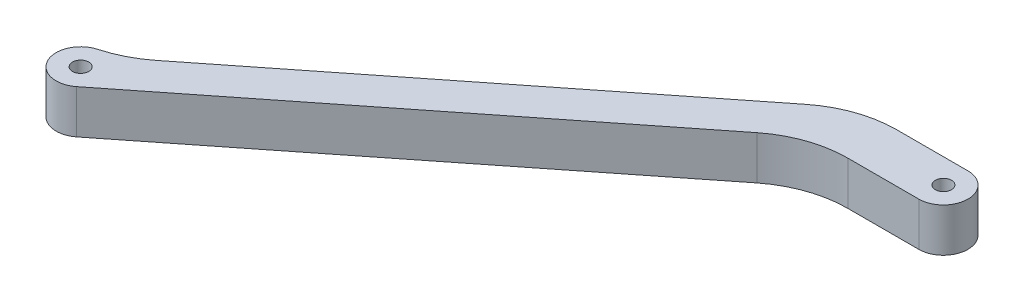
ISO-10303-21;
HEADER;
FILE_DESCRIPTION(('STEP AP214'),'2;1');
FILE_NAME('part.step','',(''),(''),'','','');
FILE_SCHEMA(('AUTOMOTIVE_DESIGN { 1 0 10303 214 1 1 1 1 }'));
ENDSEC;
DATA;
#1=APPLICATION_CONTEXT('core data for automotive mechanical design processes');
#2=APPLICATION_PROTOCOL_DEFINITION('international standard','automotive_design',2000,#1);
#3=PRODUCT_CONTEXT('',#1,'mechanical');
#4=PRODUCT('Part','Part','',(#3));
#5=PRODUCT_RELATED_PRODUCT_CATEGORY('part','',(#4));
#6=PRODUCT_DEFINITION_FORMATION('','',#4);
#7=PRODUCT_DEFINITION_CONTEXT('part definition',#1,'design');
#8=PRODUCT_DEFINITION('design','',#6,#7);
#9=PRODUCT_DEFINITION_SHAPE('','',#8);
#10=(LENGTH_UNIT() NAMED_UNIT(*) SI_UNIT(.MILLI.,.METRE.));
#11=(NAMED_UNIT(*) PLANE_ANGLE_UNIT() SI_UNIT($,.RADIAN.));
#12=(NAMED_UNIT(*) SI_UNIT($,.STERADIAN.) SOLID_ANGLE_UNIT());
#13=UNCERTAINTY_MEASURE_WITH_UNIT(LENGTH_MEASURE(1.E-05),#10,'distance_accuracy_value','');
#14=(GEOMETRIC_REPRESENTATION_CONTEXT(3) GLOBAL_UNCERTAINTY_ASSIGNED_CONTEXT((#13)) GLOBAL_UNIT_ASSIGNED_CONTEXT((#10,
#11,#12)) REPRESENTATION_CONTEXT('',''));
#15=CARTESIAN_POINT('',(0.,0.,0.));
#16=DIRECTION('',(0.,0.,1.));
#17=DIRECTION('',(1.,0.,0.));
#18=AXIS2_PLACEMENT_3D('',#15,#16,#17);
#19=CARTESIAN_POINT('',(49.,-4.,-30.1999999999999));
#20=DIRECTION('',(0.,1.,0.));
#21=DIRECTION('',(0.,0.,1.));
#22=AXIS2_PLACEMENT_3D('',#19,#20,#21);
#23=CYLINDRICAL_SURFACE('',#22,2.25);
#24=CARTESIAN_POINT('',(49.,0.,-30.1999999999999));
#25=DIRECTION('',(0.,1.,0.));
#26=DIRECTION('',(0.,0.,1.));
#27=AXIS2_PLACEMENT_3D('',#24,#25,#26);
#28=CIRCLE('',#27,2.25);
#29=CARTESIAN_POINT('',(49.,0.,-27.9499999999999));
#30=VERTEX_POINT('',#29);
#31=CARTESIAN_POINT('',(49.,0.,-32.4499999999999));
#32=VERTEX_POINT('',#31);
#33=EDGE_CURVE('E157',#30,#32,#28,.T.);
#34=ORIENTED_EDGE('',*,*,#33,.F.);
#35=DIRECTION('',(0.,1.,0.));
#36=VECTOR('',#35,1.);
#37=CARTESIAN_POINT('',(49.,-4.,-27.9499999999999));
#38=LINE('',#37,#36);
#39=CARTESIAN_POINT('',(49.,-4.,-27.9499999999999));
#40=VERTEX_POINT('',#39);
#41=EDGE_CURVE('E138',#40,#30,#38,.T.);
#42=ORIENTED_EDGE('',*,*,#41,.F.);
#43=CARTESIAN_POINT('',(49.,-4.,-30.1999999999999));
#44=DIRECTION('',(0.,1.,0.));
#45=DIRECTION('',(0.,0.,1.));
#46=AXIS2_PLACEMENT_3D('',#43,#44,#45);
#47=CIRCLE('',#46,2.25);
#48=CARTESIAN_POINT('',(49.,-4.,-32.4499999999999));
#49=VERTEX_POINT('',#48);
#50=EDGE_CURVE('E117',#40,#49,#47,.T.);
#51=ORIENTED_EDGE('',*,*,#50,.T.);
#52=DIRECTION('',(0.,1.,0.));
#53=VECTOR('',#52,1.);
#54=CARTESIAN_POINT('',(49.,-4.,-32.4499999999999));
#55=LINE('',#54,#53);
#56=EDGE_CURVE('E126',#49,#32,#55,.T.);
#57=ORIENTED_EDGE('',*,*,#56,.T.);
#58=EDGE_LOOP('',(#34,#42,#51,#57));
#59=FACE_BOUND('',#58,.T.);
#60=ADVANCED_FACE('F40',(#59),#23,.T.);
#61=CARTESIAN_POINT('',(0.,-4.,-27.9499999999999));
#62=DIRECTION('',(0.,0.,1.));
#63=DIRECTION('',(1.,0.,0.));
#64=AXIS2_PLACEMENT_3D('',#61,#62,#63);
#65=PLANE('',#64);
#66=DIRECTION('',(1.,0.,0.));
#67=VECTOR('',#66,1.);
#68=CARTESIAN_POINT('',(0.,0.,-27.9499999999999));
#69=LINE('',#68,#67);
#70=CARTESIAN_POINT('',(42.474119998746,0.,-27.9499999999999));
#71=VERTEX_POINT('',#70);
#72=EDGE_CURVE('E168',#71,#30,#69,.T.);
#73=ORIENTED_EDGE('',*,*,#72,.F.);
#74=DIRECTION('',(0.,1.,0.));
#75=VECTOR('',#74,1.);
#76=CARTESIAN_POINT('',(42.474119998746,-4.,-27.9499999999999));
#77=LINE('',#76,#75);
#78=CARTESIAN_POINT('',(42.474119998746,-4.,-27.9499999999999));
#79=VERTEX_POINT('',#78);
#80=EDGE_CURVE('E189',#71,#79,#77,.F.);
#81=ORIENTED_EDGE('',*,*,#80,.T.);
#82=DIRECTION('',(1.,0.,0.));
#83=VECTOR('',#82,1.);
#84=CARTESIAN_POINT('',(0.,-4.,-27.9499999999999));
#85=LINE('',#84,#83);
#86=EDGE_CURVE('E150',#79,#40,#85,.T.);
#87=ORIENTED_EDGE('',*,*,#86,.T.);
#88=ORIENTED_EDGE('',*,*,#41,.T.);
#89=EDGE_LOOP('',(#73,#81,#87,#88));
#90=FACE_BOUND('',#89,.T.);
#91=ADVANCED_FACE('F203',(#90),#65,.T.);
#92=CARTESIAN_POINT('',(1.39498602492714,-4.,1.76536511528295));
#93=DIRECTION('',(-0.619993788856505,0.,-0.784606717903533));
#94=DIRECTION('',(-0.784606717903533,0.,0.619993788856505));
#95=AXIS2_PLACEMENT_3D('',#92,#93,#94);
#96=PLANE('',#95);
#97=DIRECTION('',(-0.784606717903534,0.,0.619993788856506));
#98=VECTOR('',#97,1.);
#99=CARTESIAN_POINT('',(1.39498602492714,-4.,1.76536511528295));
#100=LINE('',#99,#98);
#101=CARTESIAN_POINT('',(36.2741821101809,-4.,-25.7960671790353));
#102=VERTEX_POINT('',#101);
#103=CARTESIAN_POINT('',(1.39498602492714,-4.,1.76536511528295));
#104=VERTEX_POINT('',#103);
#105=EDGE_CURVE('E148',#102,#104,#100,.T.);
#106=ORIENTED_EDGE('',*,*,#105,.F.);
#107=DIRECTION('',(0.,1.,0.));
#108=VECTOR('',#107,1.);
#109=CARTESIAN_POINT('',(36.2741821101809,-4.,-25.7960671790353));
#110=LINE('',#109,#108);
#111=CARTESIAN_POINT('',(36.2741821101809,0.,-25.7960671790353));
#112=VERTEX_POINT('',#111);
#113=EDGE_CURVE('E186',#102,#112,#110,.T.);
#114=ORIENTED_EDGE('',*,*,#113,.T.);
#115=DIRECTION('',(-0.784606717903534,0.,0.619993788856506));
#116=VECTOR('',#115,1.);
#117=CARTESIAN_POINT('',(1.39498602492714,0.,1.76536511528295));
#118=LINE('',#117,#116);
#119=CARTESIAN_POINT('',(1.39498602492714,0.,1.76536511528295));
#120=VERTEX_POINT('',#119);
#121=EDGE_CURVE('E166',#112,#120,#118,.T.);
#122=ORIENTED_EDGE('',*,*,#121,.T.);
#123=DIRECTION('',(0.,1.,0.));
#124=VECTOR('',#123,1.);
#125=CARTESIAN_POINT('',(1.39498602492714,-4.,1.76536511528295));
#126=LINE('',#125,#124);
#127=EDGE_CURVE('E133',#104,#120,#126,.T.);
#128=ORIENTED_EDGE('',*,*,#127,.F.);
#129=EDGE_LOOP('',(#106,#114,#122,#128));
#130=FACE_BOUND('',#129,.T.);
#131=ADVANCED_FACE('F205',(#130),#96,.F.);
#132=CARTESIAN_POINT('',(0.,-4.,0.));
#133=DIRECTION('',(0.,1.,0.));
#134=DIRECTION('',(0.,0.,1.));
#135=AXIS2_PLACEMENT_3D('',#132,#133,#134);
#136=CYLINDRICAL_SURFACE('',#135,2.25);
#137=CARTESIAN_POINT('',(0.,0.,0.));
#138=DIRECTION('',(0.,1.,0.));
#139=DIRECTION('',(0.,0.,1.));
#140=AXIS2_PLACEMENT_3D('',#137,#138,#139);
#141=CIRCLE('',#140,2.25);
#142=CARTESIAN_POINT('',(-0.596371316371873,0.,-2.16952558247394));
#143=VERTEX_POINT('',#142);
#144=EDGE_CURVE('E163',#143,#120,#141,.T.);
#145=ORIENTED_EDGE('',*,*,#144,.F.);
#146=DIRECTION('',(0.,1.,0.));
#147=VECTOR('',#146,1.);
#148=CARTESIAN_POINT('',(-0.596371316371873,-4.,-2.16952558247394));
#149=LINE('',#148,#147);
#150=CARTESIAN_POINT('',(-0.596371316371873,-4.,-2.16952558247394));
#151=VERTEX_POINT('',#150);
#152=EDGE_CURVE('E55',#143,#151,#149,.F.);
#153=ORIENTED_EDGE('',*,*,#152,.T.);
#154=CARTESIAN_POINT('',(0.,-4.,0.));
#155=DIRECTION('',(0.,1.,0.));
#156=DIRECTION('',(0.,0.,1.));
#157=AXIS2_PLACEMENT_3D('',#154,#155,#156);
#158=CIRCLE('',#157,2.25);
#159=EDGE_CURVE('E146',#151,#104,#158,.T.);
#160=ORIENTED_EDGE('',*,*,#159,.T.);
#161=ORIENTED_EDGE('',*,*,#127,.T.);
#162=EDGE_LOOP('',(#145,#153,#160,#161));
#163=FACE_BOUND('',#162,.T.);
#164=ADVANCED_FACE('F239',(#163),#136,.T.);
#165=CARTESIAN_POINT('',(-0.794044788151609,-4.,-1.00486954272413));
#166=DIRECTION('',(0.619993788856506,0.,0.784606717903533));
#167=DIRECTION('',(0.784606717903533,0.,-0.619993788856506));
#168=AXIS2_PLACEMENT_3D('',#165,#166,#167);
#169=PLANE('',#168);
#170=DIRECTION('',(0.784606717903533,0.,-0.619993788856506));
#171=VECTOR('',#170,1.);
#172=CARTESIAN_POINT('',(-0.794044788151609,0.,-1.00486954272413));
#173=LINE('',#172,#171);
#174=CARTESIAN_POINT('',(2.9530273883182,0.,-3.965794325545));
#175=VERTEX_POINT('',#174);
#176=CARTESIAN_POINT('',(36.2741821101809,0.,-30.2960671790353));
#177=VERTEX_POINT('',#176);
#178=EDGE_CURVE('E160',#175,#177,#173,.T.);
#179=ORIENTED_EDGE('',*,*,#178,.T.);
#180=DIRECTION('',(0.,1.,0.));
#181=VECTOR('',#180,1.);
#182=CARTESIAN_POINT('',(36.2741821101809,-4.,-30.2960671790353));
#183=LINE('',#182,#181);
#184=CARTESIAN_POINT('',(36.2741821101809,-4.,-30.2960671790353));
#185=VERTEX_POINT('',#184);
#186=EDGE_CURVE('E182',#177,#185,#183,.F.);
#187=ORIENTED_EDGE('',*,*,#186,.T.);
#188=DIRECTION('',(0.784606717903533,0.,-0.619993788856506));
#189=VECTOR('',#188,1.);
#190=CARTESIAN_POINT('',(-0.794044788151609,-4.,-1.00486954272413));
#191=LINE('',#190,#189);
#192=CARTESIAN_POINT('',(2.9530273883182,-4.,-3.965794325545));
#193=VERTEX_POINT('',#192);
#194=EDGE_CURVE('E123',#193,#185,#191,.T.);
#195=ORIENTED_EDGE('',*,*,#194,.F.);
#196=DIRECTION('',(0.,1.,0.));
#197=VECTOR('',#196,1.);
#198=CARTESIAN_POINT('',(2.9530273883182,-4.,-3.965794325545));
#199=LINE('',#198,#197);
#200=EDGE_CURVE('E179',#193,#175,#199,.T.);
#201=ORIENTED_EDGE('',*,*,#200,.T.);
#202=EDGE_LOOP('',(#179,#187,#195,#201));
#203=FACE_BOUND('',#202,.T.);
#204=ADVANCED_FACE('F214',(#203),#169,.F.);
#205=CARTESIAN_POINT('',(0.,-4.,0.));
#206=DIRECTION('',(0.,1.,0.));
#207=DIRECTION('',(0.,0.,1.));
#208=AXIS2_PLACEMENT_3D('',#205,#206,#207);
#209=CYLINDRICAL_SURFACE('',#208,0.750000000000001);
#210=CARTESIAN_POINT('',(0.,-4.,0.));
#211=DIRECTION('',(0.,1.,0.));
#212=DIRECTION('',(0.,0.,1.));
#213=AXIS2_PLACEMENT_3D('',#210,#211,#212);
#214=CIRCLE('',#213,0.750000000000001);
#215=CARTESIAN_POINT('',(0.,-4.,0.750000000000001));
#216=VERTEX_POINT('',#215);
#217=EDGE_CURVE('E152',#216,#216,#214,.T.);
#218=ORIENTED_EDGE('',*,*,#217,.F.);
#219=EDGE_LOOP('',(#218));
#220=FACE_BOUND('',#219,.T.);
#221=CARTESIAN_POINT('',(0.,0.,0.));
#222=DIRECTION('',(0.,1.,0.));
#223=DIRECTION('',(0.,0.,1.));
#224=AXIS2_PLACEMENT_3D('',#221,#222,#223);
#225=CIRCLE('',#224,0.750000000000001);
#226=CARTESIAN_POINT('',(0.,0.,0.750000000000001));
#227=VERTEX_POINT('',#226);
#228=EDGE_CURVE('E142',#227,#227,#225,.T.);
#229=ORIENTED_EDGE('',*,*,#228,.T.);
#230=EDGE_LOOP('',(#229));
#231=FACE_BOUND('',#230,.T.);
#232=ADVANCED_FACE('F236',(#220,#231),#209,.F.);
#233=CARTESIAN_POINT('',(0.,-4.,-32.4499999999999));
#234=DIRECTION('',(0.,0.,1.));
#235=DIRECTION('',(1.,0.,0.));
#236=AXIS2_PLACEMENT_3D('',#233,#234,#235);
#237=PLANE('',#236);
#238=DIRECTION('',(1.,0.,0.));
#239=VECTOR('',#238,1.);
#240=CARTESIAN_POINT('',(0.,-4.,-32.4499999999999));
#241=LINE('',#240,#239);
#242=CARTESIAN_POINT('',(42.4741199987459,-4.,-32.4499999999999));
#243=VERTEX_POINT('',#242);
#244=EDGE_CURVE('E111',#243,#49,#241,.T.);
#245=ORIENTED_EDGE('',*,*,#244,.F.);
#246=DIRECTION('',(0.,1.,0.));
#247=VECTOR('',#246,1.);
#248=CARTESIAN_POINT('',(42.4741199987459,-4.,-32.4499999999999));
#249=LINE('',#248,#247);
#250=CARTESIAN_POINT('',(42.4741199987459,0.,-32.4499999999999));
#251=VERTEX_POINT('',#250);
#252=EDGE_CURVE('E173',#243,#251,#249,.T.);
#253=ORIENTED_EDGE('',*,*,#252,.T.);
#254=DIRECTION('',(1.,0.,0.));
#255=VECTOR('',#254,1.);
#256=CARTESIAN_POINT('',(0.,0.,-32.4499999999999));
#257=LINE('',#256,#255);
#258=EDGE_CURVE('E129',#251,#32,#257,.T.);
#259=ORIENTED_EDGE('',*,*,#258,.T.);
#260=ORIENTED_EDGE('',*,*,#56,.F.);
#261=EDGE_LOOP('',(#245,#253,#259,#260));
#262=FACE_BOUND('',#261,.T.);
#263=ADVANCED_FACE('F127',(#262),#237,.F.);
#264=CARTESIAN_POINT('',(49.,-4.,-30.1999999999999));
#265=DIRECTION('',(0.,1.,0.));
#266=DIRECTION('',(0.,0.,1.));
#267=AXIS2_PLACEMENT_3D('',#264,#265,#266);
#268=CYLINDRICAL_SURFACE('',#267,0.749999999999999);
#269=CARTESIAN_POINT('',(49.,-4.,-30.1999999999999));
#270=DIRECTION('',(0.,1.,0.));
#271=DIRECTION('',(0.,0.,1.));
#272=AXIS2_PLACEMENT_3D('',#269,#270,#271);
#273=CIRCLE('',#272,0.749999999999999);
#274=CARTESIAN_POINT('',(49.,-4.,-29.4499999999999));
#275=VERTEX_POINT('',#274);
#276=EDGE_CURVE('E134',#275,#275,#273,.T.);
#277=ORIENTED_EDGE('',*,*,#276,.F.);
#278=EDGE_LOOP('',(#277));
#279=FACE_BOUND('',#278,.T.);
#280=CARTESIAN_POINT('',(49.,0.,-30.1999999999999));
#281=DIRECTION('',(0.,1.,0.));
#282=DIRECTION('',(0.,0.,1.));
#283=AXIS2_PLACEMENT_3D('',#280,#281,#282);
#284=CIRCLE('',#283,0.749999999999999);
#285=CARTESIAN_POINT('',(49.,0.,-29.4499999999999));
#286=VERTEX_POINT('',#285);
#287=EDGE_CURVE('E139',#286,#286,#284,.T.);
#288=ORIENTED_EDGE('',*,*,#287,.T.);
#289=EDGE_LOOP('',(#288));
#290=FACE_BOUND('',#289,.T.);
#291=ADVANCED_FACE('F235',(#279,#290),#268,.F.);
#292=CARTESIAN_POINT('',(0.,-4.,0.));
#293=DIRECTION('',(0.,1.,0.));
#294=DIRECTION('',(0.,0.,1.));
#295=AXIS2_PLACEMENT_3D('',#292,#293,#294);
#296=PLANE('',#295);
#297=ORIENTED_EDGE('',*,*,#194,.T.);
#298=CARTESIAN_POINT('',(42.4741199987459,-4.,-22.4499999999999));
#299=DIRECTION('',(0.,1.,0.));
#300=DIRECTION('',(0.,0.,1.));
#301=AXIS2_PLACEMENT_3D('',#298,#299,#300);
#302=CIRCLE('',#301,10.);
#303=EDGE_CURVE('E119',#185,#243,#302,.F.);
#304=ORIENTED_EDGE('',*,*,#303,.T.);
#305=ORIENTED_EDGE('',*,*,#244,.T.);
#306=ORIENTED_EDGE('',*,*,#50,.F.);
#307=ORIENTED_EDGE('',*,*,#86,.F.);
#308=CARTESIAN_POINT('',(42.474119998746,-4.,-17.9499999999999));
#309=DIRECTION('',(0.,1.,0.));
#310=DIRECTION('',(0.,0.,1.));
#311=AXIS2_PLACEMENT_3D('',#308,#309,#310);
#312=CIRCLE('',#311,10.);
#313=EDGE_CURVE('E11',#79,#102,#312,.T.);
#314=ORIENTED_EDGE('',*,*,#313,.T.);
#315=ORIENTED_EDGE('',*,*,#105,.T.);
#316=ORIENTED_EDGE('',*,*,#159,.F.);
#317=CARTESIAN_POINT('',(-3.24691050024686,-4.,-11.8118615045803));
#318=DIRECTION('',(0.,1.,0.));
#319=DIRECTION('',(0.,0.,1.));
#320=AXIS2_PLACEMENT_3D('',#317,#318,#319);
#321=CIRCLE('',#320,10.);
#322=EDGE_CURVE('E193',#151,#193,#321,.T.);
#323=ORIENTED_EDGE('',*,*,#322,.T.);
#324=EDGE_LOOP('',(#297,#304,#305,#306,#307,#314,#315,#316,#323));
#325=FACE_BOUND('',#324,.T.);
#326=ORIENTED_EDGE('',*,*,#217,.T.);
#327=EDGE_LOOP('',(#326));
#328=FACE_BOUND('',#327,.T.);
#329=ORIENTED_EDGE('',*,*,#276,.T.);
#330=EDGE_LOOP('',(#329));
#331=FACE_BOUND('',#330,.T.);
#332=ADVANCED_FACE('F114',(#325,#328,#331),#296,.F.);
#333=CARTESIAN_POINT('',(0.,0.,0.));
#334=DIRECTION('',(0.,1.,0.));
#335=DIRECTION('',(0.,0.,1.));
#336=AXIS2_PLACEMENT_3D('',#333,#334,#335);
#337=PLANE('',#336);
#338=ORIENTED_EDGE('',*,*,#258,.F.);
#339=CARTESIAN_POINT('',(42.4741199987459,0.,-22.4499999999999));
#340=DIRECTION('',(0.,1.,0.));
#341=DIRECTION('',(0.,0.,1.));
#342=AXIS2_PLACEMENT_3D('',#339,#340,#341);
#343=CIRCLE('',#342,10.);
#344=EDGE_CURVE('E177',#251,#177,#343,.T.);
#345=ORIENTED_EDGE('',*,*,#344,.T.);
#346=ORIENTED_EDGE('',*,*,#178,.F.);
#347=CARTESIAN_POINT('',(-3.24691050024686,0.,-11.8118615045803));
#348=DIRECTION('',(0.,1.,0.));
#349=DIRECTION('',(0.,0.,1.));
#350=AXIS2_PLACEMENT_3D('',#347,#348,#349);
#351=CIRCLE('',#350,10.);
#352=EDGE_CURVE('E191',#175,#143,#351,.F.);
#353=ORIENTED_EDGE('',*,*,#352,.T.);
#354=ORIENTED_EDGE('',*,*,#144,.T.);
#355=ORIENTED_EDGE('',*,*,#121,.F.);
#356=CARTESIAN_POINT('',(42.474119998746,0.,-17.9499999999999));
#357=DIRECTION('',(0.,1.,0.));
#358=DIRECTION('',(0.,0.,1.));
#359=AXIS2_PLACEMENT_3D('',#356,#357,#358);
#360=CIRCLE('',#359,10.);
#361=EDGE_CURVE('E48',#112,#71,#360,.F.);
#362=ORIENTED_EDGE('',*,*,#361,.T.);
#363=ORIENTED_EDGE('',*,*,#72,.T.);
#364=ORIENTED_EDGE('',*,*,#33,.T.);
#365=EDGE_LOOP('',(#338,#345,#346,#353,#354,#355,#362,#363,#364));
#366=FACE_BOUND('',#365,.T.);
#367=ORIENTED_EDGE('',*,*,#228,.F.);
#368=EDGE_LOOP('',(#367));
#369=FACE_BOUND('',#368,.T.);
#370=ORIENTED_EDGE('',*,*,#287,.F.);
#371=EDGE_LOOP('',(#370));
#372=FACE_BOUND('',#371,.T.);
#373=ADVANCED_FACE('F197',(#366,#369,#372),#337,.T.);
#374=CARTESIAN_POINT('',(42.4741199987459,-4.,-22.4499999999999));
#375=DIRECTION('',(0.,1.,0.));
#376=DIRECTION('',(0.,0.,1.));
#377=AXIS2_PLACEMENT_3D('',#374,#375,#376);
#378=CYLINDRICAL_SURFACE('',#377,10.);
#379=ORIENTED_EDGE('',*,*,#303,.F.);
#380=ORIENTED_EDGE('',*,*,#186,.F.);
#381=ORIENTED_EDGE('',*,*,#344,.F.);
#382=ORIENTED_EDGE('',*,*,#252,.F.);
#383=EDGE_LOOP('',(#379,#380,#381,#382));
#384=FACE_BOUND('',#383,.T.);
#385=ADVANCED_FACE('F217',(#384),#378,.T.);
#386=CARTESIAN_POINT('',(-3.24691050024686,-4.,-11.8118615045803));
#387=DIRECTION('',(0.,1.,0.));
#388=DIRECTION('',(0.,0.,1.));
#389=AXIS2_PLACEMENT_3D('',#386,#387,#388);
#390=CYLINDRICAL_SURFACE('',#389,10.);
#391=ORIENTED_EDGE('',*,*,#322,.F.);
#392=ORIENTED_EDGE('',*,*,#152,.F.);
#393=ORIENTED_EDGE('',*,*,#352,.F.);
#394=ORIENTED_EDGE('',*,*,#200,.F.);
#395=EDGE_LOOP('',(#391,#392,#393,#394));
#396=FACE_BOUND('',#395,.T.);
#397=ADVANCED_FACE('F211',(#396),#390,.F.);
#398=CARTESIAN_POINT('',(42.474119998746,-4.,-17.9499999999999));
#399=DIRECTION('',(0.,1.,0.));
#400=DIRECTION('',(0.,0.,1.));
#401=AXIS2_PLACEMENT_3D('',#398,#399,#400);
#402=CYLINDRICAL_SURFACE('',#401,10.);
#403=ORIENTED_EDGE('',*,*,#313,.F.);
#404=ORIENTED_EDGE('',*,*,#80,.F.);
#405=ORIENTED_EDGE('',*,*,#361,.F.);
#406=ORIENTED_EDGE('',*,*,#113,.F.);
#407=EDGE_LOOP('',(#403,#404,#405,#406));
#408=FACE_BOUND('',#407,.T.);
#409=ADVANCED_FACE('F42',(#408),#402,.F.);
#410=CLOSED_SHELL('',(#60,#91,#131,#164,#204,#232,#263,#291,#332,#373,#385,#397,#409));
#411=MANIFOLD_SOLID_BREP('B2',#410);
#412=ADVANCED_BREP_SHAPE_REPRESENTATION('',(#18,#411),#14);
#413=SHAPE_DEFINITION_REPRESENTATION(#9,#412);
ENDSEC;
END-ISO-10303-21;
